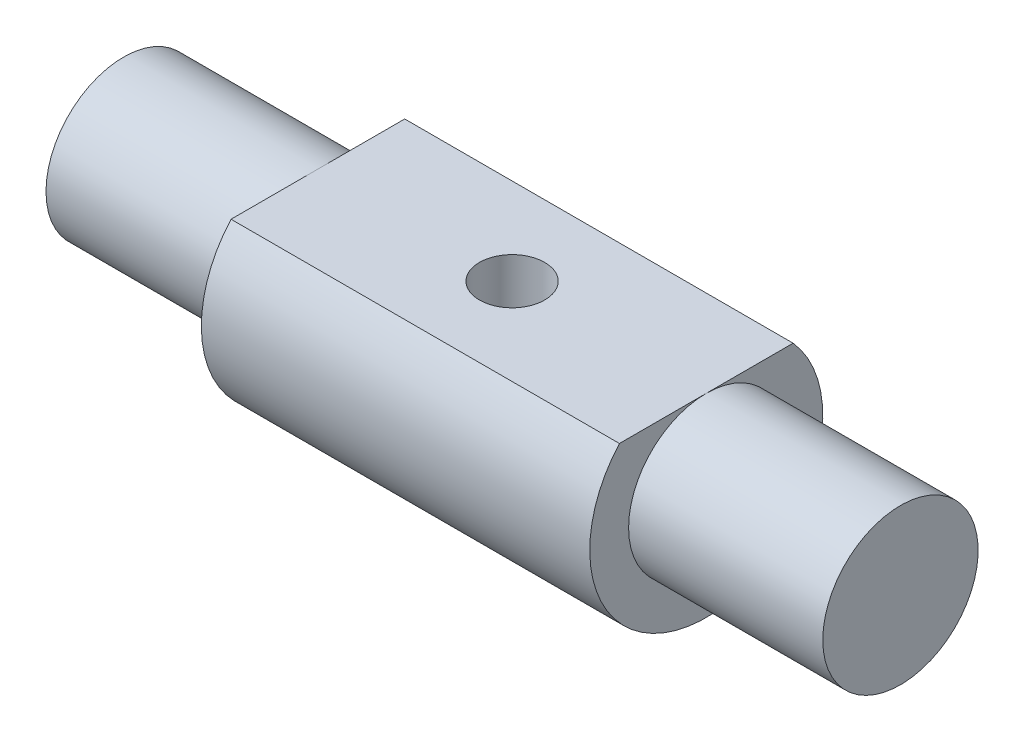
ISO-10303-21;
HEADER;
FILE_DESCRIPTION(('STEP AP214'),'2;1');
FILE_NAME('part.step','',(''),(''),'','','');
FILE_SCHEMA(('AUTOMOTIVE_DESIGN { 1 0 10303 214 1 1 1 1 }'));
ENDSEC;
DATA;
#1=APPLICATION_CONTEXT('core data for automotive mechanical design processes');
#2=APPLICATION_PROTOCOL_DEFINITION('international standard','automotive_design',2000,#1);
#3=PRODUCT_CONTEXT('',#1,'mechanical');
#4=PRODUCT('Part','Part','',(#3));
#5=PRODUCT_RELATED_PRODUCT_CATEGORY('part','',(#4));
#6=PRODUCT_DEFINITION_FORMATION('','',#4);
#7=PRODUCT_DEFINITION_CONTEXT('part definition',#1,'design');
#8=PRODUCT_DEFINITION('design','',#6,#7);
#9=PRODUCT_DEFINITION_SHAPE('','',#8);
#10=(LENGTH_UNIT() NAMED_UNIT(*) SI_UNIT(.MILLI.,.METRE.));
#11=(NAMED_UNIT(*) PLANE_ANGLE_UNIT() SI_UNIT($,.RADIAN.));
#12=(NAMED_UNIT(*) SI_UNIT($,.STERADIAN.) SOLID_ANGLE_UNIT());
#13=UNCERTAINTY_MEASURE_WITH_UNIT(LENGTH_MEASURE(1.E-05),#10,'distance_accuracy_value','');
#14=(GEOMETRIC_REPRESENTATION_CONTEXT(3) GLOBAL_UNCERTAINTY_ASSIGNED_CONTEXT((#13)) GLOBAL_UNIT_ASSIGNED_CONTEXT((#10,
#11,#12)) REPRESENTATION_CONTEXT('',''));
#15=CARTESIAN_POINT('',(0.,0.,0.));
#16=DIRECTION('',(0.,0.,1.));
#17=DIRECTION('',(1.,0.,0.));
#18=AXIS2_PLACEMENT_3D('',#15,#16,#17);
#19=CARTESIAN_POINT('',(0.,0.,0.));
#20=DIRECTION('',(-1.,0.,0.));
#21=DIRECTION('',(0.,0.,1.));
#22=AXIS2_PLACEMENT_3D('',#19,#20,#21);
#23=CYLINDRICAL_SURFACE('',#22,7.5);
#24=CARTESIAN_POINT('',(0.,-7.2,2.09999999999999));
#25=CARTESIAN_POINT('',(0.115448894828676,-7.2000017509261,2.09999769142371));
#26=CARTESIAN_POINT('',(0.230921424679272,-7.20280713265303,2.090447258008));
#27=CARTESIAN_POINT('',(0.458515712449795,-7.21368770991474,2.05258019102824));
#28=CARTESIAN_POINT('',(0.570635988813941,-7.22176520052275,2.02425538445371));
#29=CARTESIAN_POINT('',(0.788199760116363,-7.24220502233452,1.94985652031882));
#30=CARTESIAN_POINT('',(0.893653023812849,-7.25456090412264,1.90380916683966));
#31=CARTESIAN_POINT('',(1.09535792393352,-7.28215690109494,1.79535769220004));
#32=CARTESIAN_POINT('',(1.19160858017576,-7.29739732300137,1.73295183131605));
#33=CARTESIAN_POINT('',(1.37482947583615,-7.32951618449187,1.59171413202466));
#34=CARTESIAN_POINT('',(1.46150844592224,-7.34642599336529,1.51251149606311));
#35=CARTESIAN_POINT('',(1.6205431520083,-7.3797086675302,1.34072490285875));
#36=CARTESIAN_POINT('',(1.69289727151185,-7.39608147204938,1.24813943745967));
#37=CARTESIAN_POINT('',(1.82246234837499,-7.42679785762244,1.0501753641818));
#38=CARTESIAN_POINT('',(1.87938086460981,-7.44110013563312,0.944598390212243));
#39=CARTESIAN_POINT('',(1.97454690823152,-7.46570231446394,0.724904746771351));
#40=CARTESIAN_POINT('',(2.01279792049924,-7.4760029622418,0.610789675797225));
#41=CARTESIAN_POINT('',(2.06859227525808,-7.49121941354851,0.380302236373026));
#42=CARTESIAN_POINT('',(2.08663176061564,-7.49626401123116,0.264058623362756));
#43=CARTESIAN_POINT('',(2.10305497873383,-7.50085154395725,0.0300927460088099));
#44=CARTESIAN_POINT('',(2.10144232524846,-7.50039549049382,-0.0876292425050772));
#45=CARTESIAN_POINT('',(2.07895011668026,-7.49412619131461,-0.317746311518629));
#46=CARTESIAN_POINT('',(2.05860706033313,-7.48846212582118,-0.43019852288703));
#47=CARTESIAN_POINT('',(2.00010196069196,-7.47259127690994,-0.650024177765253));
#48=CARTESIAN_POINT('',(1.96193885256542,-7.4623842220287,-0.75739731735417));
#49=CARTESIAN_POINT('',(1.86848460644453,-7.43835884069074,-0.965349801263518));
#50=CARTESIAN_POINT('',(1.81301555069456,-7.42450324668395,-1.06584470618674));
#51=CARTESIAN_POINT('',(1.68666204006246,-7.39466485562083,-1.25627862457918));
#52=CARTESIAN_POINT('',(1.61577431925669,-7.37868160817165,-1.34621539544035));
#53=CARTESIAN_POINT('',(1.45777245644652,-7.34567522057905,-1.51618305590153));
#54=CARTESIAN_POINT('',(1.37019141589659,-7.32863518998309,-1.59577717509012));
#55=CARTESIAN_POINT('',(1.18275131354796,-7.29591665217891,-1.73926156835204));
#56=CARTESIAN_POINT('',(1.08289133646101,-7.28023824661686,-1.80315067068665));
#57=CARTESIAN_POINT('',(0.872703330004007,-7.25194501002576,-1.91379030231589));
#58=CARTESIAN_POINT('',(0.762303294278444,-7.23935371206725,-1.96041048527215));
#59=CARTESIAN_POINT('',(0.534789447216039,-7.21894665875122,-2.03427979371573));
#60=CARTESIAN_POINT('',(0.417677509366761,-7.21112957780356,-2.06153429654469));
#61=CARTESIAN_POINT('',(0.184177346036703,-7.20144181427927,-2.09512133703559));
#62=CARTESIAN_POINT('',(0.0678911726799895,-7.19938465899453,-2.10211023295226));
#63=CARTESIAN_POINT('',(-0.16419067902114,-7.20093733719562,-2.09678562260948));
#64=CARTESIAN_POINT('',(-0.279986414098294,-7.20454649620961,-2.08447441367736));
#65=CARTESIAN_POINT('',(-0.505192111961204,-7.21684386770043,-2.04148011473316));
#66=CARTESIAN_POINT('',(-0.614686177437148,-7.22541993924817,-2.01120230768184));
#67=CARTESIAN_POINT('',(-0.827038759285992,-7.24657269498035,-1.9335954321454));
#68=CARTESIAN_POINT('',(-0.92989634292425,-7.2591499400491,-1.88626397295672));
#69=CARTESIAN_POINT('',(-1.12877269761775,-7.28726240690147,-1.77459509136293));
#70=CARTESIAN_POINT('',(-1.224569166007,-7.30286116048027,-1.70987813502038));
#71=CARTESIAN_POINT('',(-1.40418314643845,-7.33511474861878,-1.56573803326782));
#72=CARTESIAN_POINT('',(-1.48799816133002,-7.35176980228926,-1.48631183008104));
#73=CARTESIAN_POINT('',(-1.64405083657379,-7.38490975407121,-1.31195238316687));
#74=CARTESIAN_POINT('',(-1.71582776949723,-7.4013718288206,-1.21660153256646));
#75=CARTESIAN_POINT('',(-1.84236295569934,-7.43172364179825,-1.0148282251243));
#76=CARTESIAN_POINT('',(-1.89712210812569,-7.44561351591507,-0.908406353625249));
#77=CARTESIAN_POINT('',(-1.98754923511423,-7.46916678636433,-0.688255620931214));
#78=CARTESIAN_POINT('',(-2.0233615963978,-7.47886204186584,-0.57458964296995));
#79=CARTESIAN_POINT('',(-2.07528178854123,-7.4930742926061,-0.342537614831903));
#80=CARTESIAN_POINT('',(-2.09139447100867,-7.49759256280785,-0.224152734238766));
#81=CARTESIAN_POINT('',(-2.10312839471999,-7.50087475153957,0.00969112124072532));
#82=CARTESIAN_POINT('',(-2.09942230404542,-7.49982757425403,0.125114144971011));
#83=CARTESIAN_POINT('',(-2.07320361138513,-7.49253071356722,0.35362688103667));
#84=CARTESIAN_POINT('',(-2.05069184855538,-7.48628126230442,0.466716697254849));
#85=CARTESIAN_POINT('',(-1.9878961395834,-7.46932613881606,0.686456269375142));
#86=CARTESIAN_POINT('',(-1.94776095431701,-7.4586578085919,0.793151611784456));
#87=CARTESIAN_POINT('',(-1.85098998719994,-7.43397489084362,0.998353701041717));
#88=CARTESIAN_POINT('',(-1.79435171944604,-7.41995979924538,1.09685921135807));
#89=CARTESIAN_POINT('',(-1.66428300177141,-7.38956927564245,1.28596610763476));
#90=CARTESIAN_POINT('',(-1.59041564694984,-7.37313745973981,1.37625788128737));
#91=CARTESIAN_POINT('',(-1.42879782153953,-7.33997403900929,1.54339107601341));
#92=CARTESIAN_POINT('',(-1.34104357518202,-7.32324235374892,1.6202288270092));
#93=CARTESIAN_POINT('',(-1.15151287771814,-7.29088892650894,1.7601810081138));
#94=CARTESIAN_POINT('',(-1.04944137267978,-7.27530525828303,1.82290552428642));
#95=CARTESIAN_POINT('',(-0.835778008759381,-7.24757503896698,1.93021956053794));
#96=CARTESIAN_POINT('',(-0.724191806851347,-7.23542646383001,1.97481976673698));
#97=CARTESIAN_POINT('',(-0.511017150350903,-7.2174445712127,2.0394730088432));
#98=CARTESIAN_POINT('',(-0.410261761127128,-7.21095909202013,2.06211391312519));
#99=CARTESIAN_POINT('',(-0.206343642914264,-7.20223632826997,2.09237736458971));
#100=CARTESIAN_POINT('',(-0.103181260938115,-7.19999843512782,2.10000206326627));
#101=CARTESIAN_POINT('',(0.,-7.2,2.09999999999999));
#102=B_SPLINE_CURVE_WITH_KNOTS('',3,(#24,#25,#26,#27,#28,#29,#30,#31,#32,#33,#34,#35,#36,#37,
#38,#39,#40,#41,#42,#43,#44,#45,#46,#47,#48,#49,#50,#51,#52,#53,#54,#55,#56,#57,#58,#59,#60,#61,
#62,#63,#64,#65,#66,#67,#68,#69,#70,#71,#72,#73,#74,#75,#76,#77,#78,#79,#80,#81,#82,#83,#84,#85,
#86,#87,#88,#89,#90,#91,#92,#93,#94,#95,#96,#97,#98,#99,#100,#101),.UNSPECIFIED.,.T.,.F.,(4,2,2,
2,2,2,2,2,2,2,2,2,2,2,2,2,2,2,2,2,2,2,2,2,2,2,2,2,2,2,2,2,2,2,2,2,2,2,4),(0.,0.345966820679475,
0.692084349409677,1.03768238213021,1.38331718404489,1.73757082880146,2.09186442676817,
2.45246381411617,2.81299585839308,3.1644693582517,3.5158782280151,3.85752460211592,
4.19919139381876,4.54449343533438,4.8898686887804,5.24690042870956,5.60395879841148,
5.96365984094945,6.32326096486548,6.67107770948493,7.01885305597462,7.35906666926099,
7.69932799470602,8.04772451120088,8.39619353426623,8.75590447674838,9.11559641039039,
9.47250627059269,9.8293282138483,10.1741178008123,10.5188920032276,10.8608102624592,
11.202780052397,11.5546053491271,11.9065264700836,12.267221716464,12.627703986753,
12.9369525819905,13.2461568654393),.UNSPECIFIED.);
#103=CARTESIAN_POINT('',(0.,-7.2,2.09999999999999));
#104=VERTEX_POINT('',#103);
#105=EDGE_CURVE('E141',#104,#104,#102,.T.);
#106=ORIENTED_EDGE('',*,*,#105,.T.);
#107=EDGE_LOOP('',(#106));
#108=FACE_BOUND('',#107,.T.);
#109=CARTESIAN_POINT('',(12.5,0.,0.));
#110=DIRECTION('',(-1.,0.,0.));
#111=DIRECTION('',(0.,0.,1.));
#112=AXIS2_PLACEMENT_3D('',#109,#110,#111);
#113=CIRCLE('',#112,7.5);
#114=CARTESIAN_POINT('',(12.5,5.,-5.59016994374947));
#115=VERTEX_POINT('',#114);
#116=CARTESIAN_POINT('',(12.5,5.,5.59016994374947));
#117=VERTEX_POINT('',#116);
#118=EDGE_CURVE('E11',#115,#117,#113,.T.);
#119=ORIENTED_EDGE('',*,*,#118,.T.);
#120=DIRECTION('',(-1.,0.,0.));
#121=VECTOR('',#120,1.);
#122=CARTESIAN_POINT('',(0.,5.,5.59016994374947));
#123=LINE('',#122,#121);
#124=CARTESIAN_POINT('',(-12.5,5.,5.59016994374947));
#125=VERTEX_POINT('',#124);
#126=EDGE_CURVE('E103',#117,#125,#123,.T.);
#127=ORIENTED_EDGE('',*,*,#126,.T.);
#128=CARTESIAN_POINT('',(-12.5,0.,0.));
#129=DIRECTION('',(-1.,0.,0.));
#130=DIRECTION('',(0.,0.,1.));
#131=AXIS2_PLACEMENT_3D('',#128,#129,#130);
#132=CIRCLE('',#131,7.5);
#133=CARTESIAN_POINT('',(-12.5,5.,-5.59016994374947));
#134=VERTEX_POINT('',#133);
#135=EDGE_CURVE('E89',#134,#125,#132,.T.);
#136=ORIENTED_EDGE('',*,*,#135,.F.);
#137=DIRECTION('',(-1.,0.,0.));
#138=VECTOR('',#137,1.);
#139=CARTESIAN_POINT('',(0.,5.,-5.59016994374947));
#140=LINE('',#139,#138);
#141=EDGE_CURVE('E60',#134,#115,#140,.F.);
#142=ORIENTED_EDGE('',*,*,#141,.T.);
#143=EDGE_LOOP('',(#119,#127,#136,#142));
#144=FACE_BOUND('',#143,.T.);
#145=ADVANCED_FACE('F45',(#108,#144),#23,.T.);
#146=CARTESIAN_POINT('',(12.5,7.5,0.));
#147=DIRECTION('',(-1.,0.,0.));
#148=DIRECTION('',(0.,0.,1.));
#149=AXIS2_PLACEMENT_3D('',#146,#147,#148);
#150=PLANE('',#149);
#151=ORIENTED_EDGE('',*,*,#118,.F.);
#152=DIRECTION('',(0.,0.,-1.));
#153=VECTOR('',#152,1.);
#154=CARTESIAN_POINT('',(12.5,5.,11.6111321451204));
#155=LINE('',#154,#153);
#156=CARTESIAN_POINT('',(12.5,5.,0.));
#157=VERTEX_POINT('',#156);
#158=EDGE_CURVE('E65',#157,#115,#155,.T.);
#159=ORIENTED_EDGE('',*,*,#158,.F.);
#160=CARTESIAN_POINT('',(12.5,0.,0.));
#161=DIRECTION('',(-1.,0.,0.));
#162=DIRECTION('',(0.,0.,1.));
#163=AXIS2_PLACEMENT_3D('',#160,#161,#162);
#164=CIRCLE('',#163,5.);
#165=EDGE_CURVE('E53',#157,#157,#164,.T.);
#166=ORIENTED_EDGE('',*,*,#165,.T.);
#167=EDGE_CURVE('E91',#117,#157,#155,.T.);
#168=ORIENTED_EDGE('',*,*,#167,.F.);
#169=EDGE_LOOP('',(#151,#159,#166,#168));
#170=FACE_BOUND('',#169,.T.);
#171=ADVANCED_FACE('F115',(#170),#150,.F.);
#172=CARTESIAN_POINT('',(0.,0.,0.));
#173=DIRECTION('',(-1.,0.,0.));
#174=DIRECTION('',(0.,0.,1.));
#175=AXIS2_PLACEMENT_3D('',#172,#173,#174);
#176=CYLINDRICAL_SURFACE('',#175,5.);
#177=ORIENTED_EDGE('',*,*,#165,.F.);
#178=EDGE_LOOP('',(#177));
#179=FACE_BOUND('',#178,.T.);
#180=CARTESIAN_POINT('',(25.,0.,0.));
#181=DIRECTION('',(-1.,0.,0.));
#182=DIRECTION('',(0.,0.,1.));
#183=AXIS2_PLACEMENT_3D('',#180,#181,#182);
#184=CIRCLE('',#183,5.);
#185=CARTESIAN_POINT('',(25.,0.,5.));
#186=VERTEX_POINT('',#185);
#187=EDGE_CURVE('E100',#186,#186,#184,.T.);
#188=ORIENTED_EDGE('',*,*,#187,.T.);
#189=EDGE_LOOP('',(#188));
#190=FACE_BOUND('',#189,.T.);
#191=ADVANCED_FACE('F117',(#179,#190),#176,.T.);
#192=CARTESIAN_POINT('',(25.,5.,0.));
#193=DIRECTION('',(-1.,0.,0.));
#194=DIRECTION('',(0.,0.,1.));
#195=AXIS2_PLACEMENT_3D('',#192,#193,#194);
#196=PLANE('',#195);
#197=ORIENTED_EDGE('',*,*,#187,.F.);
#198=EDGE_LOOP('',(#197));
#199=FACE_BOUND('',#198,.T.);
#200=ADVANCED_FACE('F120',(#199),#196,.F.);
#201=CARTESIAN_POINT('',(-12.5,7.5,0.));
#202=DIRECTION('',(1.,0.,0.));
#203=DIRECTION('',(0.,0.,1.));
#204=AXIS2_PLACEMENT_3D('',#201,#202,#203);
#205=PLANE('',#204);
#206=ORIENTED_EDGE('',*,*,#135,.T.);
#207=DIRECTION('',(0.,0.,1.));
#208=VECTOR('',#207,1.);
#209=CARTESIAN_POINT('',(-12.5,5.,11.6111321451204));
#210=LINE('',#209,#208);
#211=CARTESIAN_POINT('',(-12.5,5.,0.));
#212=VERTEX_POINT('',#211);
#213=EDGE_CURVE('E78',#212,#125,#210,.T.);
#214=ORIENTED_EDGE('',*,*,#213,.F.);
#215=CARTESIAN_POINT('',(-12.5,0.,0.));
#216=DIRECTION('',(-1.,0.,0.));
#217=DIRECTION('',(0.,0.,1.));
#218=AXIS2_PLACEMENT_3D('',#215,#216,#217);
#219=CIRCLE('',#218,5.);
#220=EDGE_CURVE('E88',#212,#212,#219,.T.);
#221=ORIENTED_EDGE('',*,*,#220,.F.);
#222=EDGE_CURVE('E75',#134,#212,#210,.T.);
#223=ORIENTED_EDGE('',*,*,#222,.F.);
#224=EDGE_LOOP('',(#206,#214,#221,#223));
#225=FACE_BOUND('',#224,.T.);
#226=ADVANCED_FACE('F87',(#225),#205,.F.);
#227=CARTESIAN_POINT('',(0.,0.,0.));
#228=DIRECTION('',(1.,0.,0.));
#229=DIRECTION('',(0.,0.,1.));
#230=AXIS2_PLACEMENT_3D('',#227,#228,#229);
#231=CYLINDRICAL_SURFACE('',#230,5.);
#232=ORIENTED_EDGE('',*,*,#220,.T.);
#233=EDGE_LOOP('',(#232));
#234=FACE_BOUND('',#233,.T.);
#235=CARTESIAN_POINT('',(-25.,0.,0.));
#236=DIRECTION('',(-1.,0.,0.));
#237=DIRECTION('',(0.,0.,1.));
#238=AXIS2_PLACEMENT_3D('',#235,#236,#237);
#239=CIRCLE('',#238,5.);
#240=CARTESIAN_POINT('',(-25.,0.,5.));
#241=VERTEX_POINT('',#240);
#242=EDGE_CURVE('E96',#241,#241,#239,.T.);
#243=ORIENTED_EDGE('',*,*,#242,.F.);
#244=EDGE_LOOP('',(#243));
#245=FACE_BOUND('',#244,.T.);
#246=ADVANCED_FACE('F93',(#234,#245),#231,.T.);
#247=CARTESIAN_POINT('',(-25.,5.,0.));
#248=DIRECTION('',(1.,0.,0.));
#249=DIRECTION('',(0.,0.,1.));
#250=AXIS2_PLACEMENT_3D('',#247,#248,#249);
#251=PLANE('',#250);
#252=ORIENTED_EDGE('',*,*,#242,.T.);
#253=EDGE_LOOP('',(#252));
#254=FACE_BOUND('',#253,.T.);
#255=ADVANCED_FACE('F164',(#254),#251,.F.);
#256=CARTESIAN_POINT('',(0.,5.,0.));
#257=DIRECTION('',(0.,-1.,0.));
#258=DIRECTION('',(0.,0.,-1.));
#259=AXIS2_PLACEMENT_3D('',#256,#257,#258);
#260=PLANE('',#259);
#261=CARTESIAN_POINT('',(0.,5.,0.));
#262=DIRECTION('',(0.,1.,0.));
#263=DIRECTION('',(0.,0.,1.));
#264=AXIS2_PLACEMENT_3D('',#261,#262,#263);
#265=CIRCLE('',#264,2.09999999999999);
#266=CARTESIAN_POINT('',(0.,5.,2.09999999999999));
#267=VERTEX_POINT('',#266);
#268=EDGE_CURVE('E155',#267,#267,#265,.T.);
#269=ORIENTED_EDGE('',*,*,#268,.F.);
#270=EDGE_LOOP('',(#269));
#271=FACE_BOUND('',#270,.T.);
#272=ORIENTED_EDGE('',*,*,#167,.T.);
#273=ORIENTED_EDGE('',*,*,#158,.T.);
#274=ORIENTED_EDGE('',*,*,#141,.F.);
#275=ORIENTED_EDGE('',*,*,#222,.T.);
#276=ORIENTED_EDGE('',*,*,#213,.T.);
#277=ORIENTED_EDGE('',*,*,#126,.F.);
#278=EDGE_LOOP('',(#272,#273,#274,#275,#276,#277));
#279=FACE_BOUND('',#278,.T.);
#280=ADVANCED_FACE('F77',(#271,#279),#260,.F.);
#281=CARTESIAN_POINT('',(0.,5.,0.));
#282=DIRECTION('',(0.,1.,0.));
#283=DIRECTION('',(0.,0.,1.));
#284=AXIS2_PLACEMENT_3D('',#281,#282,#283);
#285=CYLINDRICAL_SURFACE('',#284,2.09999999999999);
#286=ORIENTED_EDGE('',*,*,#105,.F.);
#287=EDGE_LOOP('',(#286));
#288=FACE_BOUND('',#287,.T.);
#289=ORIENTED_EDGE('',*,*,#268,.T.);
#290=EDGE_LOOP('',(#289));
#291=FACE_BOUND('',#290,.T.);
#292=ADVANCED_FACE('F158',(#288,#291),#285,.F.);
#293=CLOSED_SHELL('',(#145,#171,#191,#200,#226,#246,#255,#280,#292));
#294=MANIFOLD_SOLID_BREP('B2',#293);
#295=ADVANCED_BREP_SHAPE_REPRESENTATION('',(#18,#294),#14);
#296=SHAPE_DEFINITION_REPRESENTATION(#9,#295);
ENDSEC;
END-ISO-10303-21;
